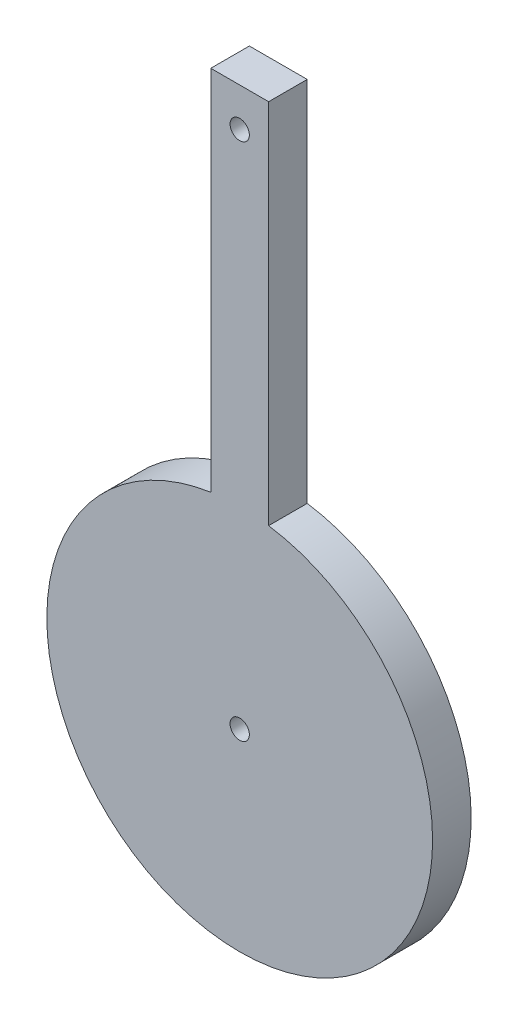
ISO-10303-21;
HEADER;
FILE_DESCRIPTION(('STEP AP214'),'2;1');
FILE_NAME('part.step','',(''),(''),'','','');
FILE_SCHEMA(('AUTOMOTIVE_DESIGN { 1 0 10303 214 1 1 1 1 }'));
ENDSEC;
DATA;
#1=APPLICATION_CONTEXT('core data for automotive mechanical design processes');
#2=APPLICATION_PROTOCOL_DEFINITION('international standard','automotive_design',2000,#1);
#3=PRODUCT_CONTEXT('',#1,'mechanical');
#4=PRODUCT('Part','Part','',(#3));
#5=PRODUCT_RELATED_PRODUCT_CATEGORY('part','',(#4));
#6=PRODUCT_DEFINITION_FORMATION('','',#4);
#7=PRODUCT_DEFINITION_CONTEXT('part definition',#1,'design');
#8=PRODUCT_DEFINITION('design','',#6,#7);
#9=PRODUCT_DEFINITION_SHAPE('','',#8);
#10=(LENGTH_UNIT() NAMED_UNIT(*) SI_UNIT(.MILLI.,.METRE.));
#11=(NAMED_UNIT(*) PLANE_ANGLE_UNIT() SI_UNIT($,.RADIAN.));
#12=(NAMED_UNIT(*) SI_UNIT($,.STERADIAN.) SOLID_ANGLE_UNIT());
#13=UNCERTAINTY_MEASURE_WITH_UNIT(LENGTH_MEASURE(1.E-05),#10,'distance_accuracy_value','');
#14=(GEOMETRIC_REPRESENTATION_CONTEXT(3) GLOBAL_UNCERTAINTY_ASSIGNED_CONTEXT((#13)) GLOBAL_UNIT_ASSIGNED_CONTEXT((#10,
#11,#12)) REPRESENTATION_CONTEXT('',''));
#15=CARTESIAN_POINT('',(0.,0.,0.));
#16=DIRECTION('',(0.,0.,1.));
#17=DIRECTION('',(1.,0.,0.));
#18=AXIS2_PLACEMENT_3D('',#15,#16,#17);
#19=CARTESIAN_POINT('',(0.,0.,-10.));
#20=DIRECTION('',(0.,0.,1.));
#21=DIRECTION('',(1.,0.,0.));
#22=AXIS2_PLACEMENT_3D('',#19,#20,#21);
#23=CYLINDRICAL_SURFACE('',#22,50.);
#24=CARTESIAN_POINT('',(0.,0.,0.));
#25=DIRECTION('',(0.,0.,1.));
#26=DIRECTION('',(1.,0.,0.));
#27=AXIS2_PLACEMENT_3D('',#24,#25,#26);
#28=CIRCLE('',#27,50.);
#29=CARTESIAN_POINT('',(-7.49999999999999,49.434299833213,0.));
#30=VERTEX_POINT('',#29);
#31=CARTESIAN_POINT('',(7.5,49.434299833213,0.));
#32=VERTEX_POINT('',#31);
#33=EDGE_CURVE('E104',#30,#32,#28,.T.);
#34=ORIENTED_EDGE('',*,*,#33,.F.);
#35=DIRECTION('',(0.,0.,1.));
#36=VECTOR('',#35,1.);
#37=CARTESIAN_POINT('',(-7.49999999999999,49.434299833213,-10.));
#38=LINE('',#37,#36);
#39=CARTESIAN_POINT('',(-7.49999999999999,49.434299833213,-10.));
#40=VERTEX_POINT('',#39);
#41=EDGE_CURVE('E11',#40,#30,#38,.T.);
#42=ORIENTED_EDGE('',*,*,#41,.F.);
#43=CARTESIAN_POINT('',(0.,0.,-10.));
#44=DIRECTION('',(0.,0.,1.));
#45=DIRECTION('',(1.,0.,0.));
#46=AXIS2_PLACEMENT_3D('',#43,#44,#45);
#47=CIRCLE('',#46,50.);
#48=CARTESIAN_POINT('',(7.5,49.434299833213,-10.));
#49=VERTEX_POINT('',#48);
#50=EDGE_CURVE('E97',#40,#49,#47,.T.);
#51=ORIENTED_EDGE('',*,*,#50,.T.);
#52=DIRECTION('',(0.,0.,1.));
#53=VECTOR('',#52,1.);
#54=CARTESIAN_POINT('',(7.5,49.434299833213,-10.));
#55=LINE('',#54,#53);
#56=EDGE_CURVE('E42',#49,#32,#55,.T.);
#57=ORIENTED_EDGE('',*,*,#56,.T.);
#58=EDGE_LOOP('',(#34,#42,#51,#57));
#59=FACE_BOUND('',#58,.T.);
#60=ADVANCED_FACE('F39',(#59),#23,.T.);
#61=CARTESIAN_POINT('',(-7.5,144.62,-10.));
#62=DIRECTION('',(-1.,0.,0.));
#63=DIRECTION('',(0.,-1.,0.));
#64=AXIS2_PLACEMENT_3D('',#61,#62,#63);
#65=PLANE('',#64);
#66=DIRECTION('',(0.,-1.,0.));
#67=VECTOR('',#66,1.);
#68=CARTESIAN_POINT('',(-7.5,144.62,0.));
#69=LINE('',#68,#67);
#70=CARTESIAN_POINT('',(-7.5,144.62,0.));
#71=VERTEX_POINT('',#70);
#72=EDGE_CURVE('E99',#71,#30,#69,.T.);
#73=ORIENTED_EDGE('',*,*,#72,.F.);
#74=DIRECTION('',(0.,0.,1.));
#75=VECTOR('',#74,1.);
#76=CARTESIAN_POINT('',(-7.5,144.62,-10.));
#77=LINE('',#76,#75);
#78=CARTESIAN_POINT('',(-7.5,144.62,-10.));
#79=VERTEX_POINT('',#78);
#80=EDGE_CURVE('E48',#79,#71,#77,.T.);
#81=ORIENTED_EDGE('',*,*,#80,.F.);
#82=DIRECTION('',(0.,-1.,0.));
#83=VECTOR('',#82,1.);
#84=CARTESIAN_POINT('',(-7.5,144.62,-10.));
#85=LINE('',#84,#83);
#86=EDGE_CURVE('E94',#79,#40,#85,.T.);
#87=ORIENTED_EDGE('',*,*,#86,.T.);
#88=ORIENTED_EDGE('',*,*,#41,.T.);
#89=EDGE_LOOP('',(#73,#81,#87,#88));
#90=FACE_BOUND('',#89,.T.);
#91=ADVANCED_FACE('F115',(#90),#65,.T.);
#92=CARTESIAN_POINT('',(7.5,144.62,-10.));
#93=DIRECTION('',(0.,1.,0.));
#94=DIRECTION('',(0.,0.,1.));
#95=AXIS2_PLACEMENT_3D('',#92,#93,#94);
#96=PLANE('',#95);
#97=DIRECTION('',(-1.,0.,0.));
#98=VECTOR('',#97,1.);
#99=CARTESIAN_POINT('',(7.5,144.62,0.));
#100=LINE('',#99,#98);
#101=CARTESIAN_POINT('',(7.5,144.62,0.));
#102=VERTEX_POINT('',#101);
#103=EDGE_CURVE('E89',#102,#71,#100,.T.);
#104=ORIENTED_EDGE('',*,*,#103,.F.);
#105=DIRECTION('',(0.,0.,1.));
#106=VECTOR('',#105,1.);
#107=CARTESIAN_POINT('',(7.5,144.62,-10.));
#108=LINE('',#107,#106);
#109=CARTESIAN_POINT('',(7.5,144.62,-10.));
#110=VERTEX_POINT('',#109);
#111=EDGE_CURVE('E84',#110,#102,#108,.T.);
#112=ORIENTED_EDGE('',*,*,#111,.F.);
#113=DIRECTION('',(-1.,0.,0.));
#114=VECTOR('',#113,1.);
#115=CARTESIAN_POINT('',(7.5,144.62,-10.));
#116=LINE('',#115,#114);
#117=EDGE_CURVE('E87',#110,#79,#116,.T.);
#118=ORIENTED_EDGE('',*,*,#117,.T.);
#119=ORIENTED_EDGE('',*,*,#80,.T.);
#120=EDGE_LOOP('',(#104,#112,#118,#119));
#121=FACE_BOUND('',#120,.T.);
#122=ADVANCED_FACE('F86',(#121),#96,.T.);
#123=CARTESIAN_POINT('',(7.5,49.434299833213,-10.));
#124=DIRECTION('',(1.,0.,0.));
#125=DIRECTION('',(0.,1.,0.));
#126=AXIS2_PLACEMENT_3D('',#123,#124,#125);
#127=PLANE('',#126);
#128=DIRECTION('',(0.,1.,0.));
#129=VECTOR('',#128,1.);
#130=CARTESIAN_POINT('',(7.5,49.434299833213,0.));
#131=LINE('',#130,#129);
#132=EDGE_CURVE('E107',#32,#102,#131,.T.);
#133=ORIENTED_EDGE('',*,*,#132,.F.);
#134=ORIENTED_EDGE('',*,*,#56,.F.);
#135=DIRECTION('',(0.,1.,0.));
#136=VECTOR('',#135,1.);
#137=CARTESIAN_POINT('',(7.5,49.434299833213,-10.));
#138=LINE('',#137,#136);
#139=EDGE_CURVE('E93',#49,#110,#138,.T.);
#140=ORIENTED_EDGE('',*,*,#139,.T.);
#141=ORIENTED_EDGE('',*,*,#111,.T.);
#142=EDGE_LOOP('',(#133,#134,#140,#141));
#143=FACE_BOUND('',#142,.T.);
#144=ADVANCED_FACE('F96',(#143),#127,.T.);
#145=CARTESIAN_POINT('',(0.,0.,-10.));
#146=DIRECTION('',(0.,0.,1.));
#147=DIRECTION('',(1.,0.,0.));
#148=AXIS2_PLACEMENT_3D('',#145,#146,#147);
#149=PLANE('',#148);
#150=CARTESIAN_POINT('',(0.,0.,-10.));
#151=DIRECTION('',(0.,0.,1.));
#152=DIRECTION('',(1.,0.,0.));
#153=AXIS2_PLACEMENT_3D('',#150,#151,#152);
#154=CIRCLE('',#153,2.5);
#155=CARTESIAN_POINT('',(2.5,0.,-10.));
#156=VERTEX_POINT('',#155);
#157=EDGE_CURVE('E151',#156,#156,#154,.F.);
#158=ORIENTED_EDGE('',*,*,#157,.F.);
#159=EDGE_LOOP('',(#158));
#160=FACE_BOUND('',#159,.T.);
#161=CARTESIAN_POINT('',(0.,134.62,-10.));
#162=DIRECTION('',(0.,0.,1.));
#163=DIRECTION('',(1.,0.,0.));
#164=AXIS2_PLACEMENT_3D('',#161,#162,#163);
#165=CIRCLE('',#164,2.5);
#166=CARTESIAN_POINT('',(2.5,134.62,-10.));
#167=VERTEX_POINT('',#166);
#168=EDGE_CURVE('E108',#167,#167,#165,.F.);
#169=ORIENTED_EDGE('',*,*,#168,.F.);
#170=EDGE_LOOP('',(#169));
#171=FACE_BOUND('',#170,.T.);
#172=ORIENTED_EDGE('',*,*,#50,.F.);
#173=ORIENTED_EDGE('',*,*,#86,.F.);
#174=ORIENTED_EDGE('',*,*,#117,.F.);
#175=ORIENTED_EDGE('',*,*,#139,.F.);
#176=EDGE_LOOP('',(#172,#173,#174,#175));
#177=FACE_BOUND('',#176,.T.);
#178=ADVANCED_FACE('F92',(#160,#171,#177),#149,.F.);
#179=CARTESIAN_POINT('',(0.,0.,0.));
#180=DIRECTION('',(0.,0.,1.));
#181=DIRECTION('',(1.,0.,0.));
#182=AXIS2_PLACEMENT_3D('',#179,#180,#181);
#183=PLANE('',#182);
#184=CARTESIAN_POINT('',(0.,0.,0.));
#185=DIRECTION('',(0.,0.,1.));
#186=DIRECTION('',(1.,0.,0.));
#187=AXIS2_PLACEMENT_3D('',#184,#185,#186);
#188=CIRCLE('',#187,2.5);
#189=CARTESIAN_POINT('',(2.5,0.,0.));
#190=VERTEX_POINT('',#189);
#191=EDGE_CURVE('E149',#190,#190,#188,.T.);
#192=ORIENTED_EDGE('',*,*,#191,.F.);
#193=EDGE_LOOP('',(#192));
#194=FACE_BOUND('',#193,.T.);
#195=CARTESIAN_POINT('',(0.,134.62,0.));
#196=DIRECTION('',(0.,0.,1.));
#197=DIRECTION('',(1.,0.,0.));
#198=AXIS2_PLACEMENT_3D('',#195,#196,#197);
#199=CIRCLE('',#198,2.5);
#200=CARTESIAN_POINT('',(2.5,134.62,0.));
#201=VERTEX_POINT('',#200);
#202=EDGE_CURVE('E152',#201,#201,#199,.T.);
#203=ORIENTED_EDGE('',*,*,#202,.F.);
#204=EDGE_LOOP('',(#203));
#205=FACE_BOUND('',#204,.T.);
#206=ORIENTED_EDGE('',*,*,#33,.T.);
#207=ORIENTED_EDGE('',*,*,#132,.T.);
#208=ORIENTED_EDGE('',*,*,#103,.T.);
#209=ORIENTED_EDGE('',*,*,#72,.T.);
#210=EDGE_LOOP('',(#206,#207,#208,#209));
#211=FACE_BOUND('',#210,.T.);
#212=ADVANCED_FACE('F114',(#194,#205,#211),#183,.T.);
#213=CARTESIAN_POINT('',(0.,134.62,-10.001));
#214=DIRECTION('',(0.,0.,1.));
#215=DIRECTION('',(1.,0.,0.));
#216=AXIS2_PLACEMENT_3D('',#213,#214,#215);
#217=CYLINDRICAL_SURFACE('',#216,2.5);
#218=ORIENTED_EDGE('',*,*,#202,.T.);
#219=EDGE_LOOP('',(#218));
#220=FACE_BOUND('',#219,.T.);
#221=ORIENTED_EDGE('',*,*,#168,.T.);
#222=EDGE_LOOP('',(#221));
#223=FACE_BOUND('',#222,.T.);
#224=ADVANCED_FACE('F133',(#220,#223),#217,.F.);
#225=CARTESIAN_POINT('',(0.,0.,-10.001));
#226=DIRECTION('',(0.,0.,1.));
#227=DIRECTION('',(1.,0.,0.));
#228=AXIS2_PLACEMENT_3D('',#225,#226,#227);
#229=CYLINDRICAL_SURFACE('',#228,2.5);
#230=ORIENTED_EDGE('',*,*,#191,.T.);
#231=EDGE_LOOP('',(#230));
#232=FACE_BOUND('',#231,.T.);
#233=ORIENTED_EDGE('',*,*,#157,.T.);
#234=EDGE_LOOP('',(#233));
#235=FACE_BOUND('',#234,.T.);
#236=ADVANCED_FACE('F140',(#232,#235),#229,.F.);
#237=CLOSED_SHELL('',(#60,#91,#122,#144,#178,#212,#224,#236));
#238=MANIFOLD_SOLID_BREP('B2',#237);
#239=ADVANCED_BREP_SHAPE_REPRESENTATION('',(#18,#238),#14);
#240=SHAPE_DEFINITION_REPRESENTATION(#9,#239);
ENDSEC;
END-ISO-10303-21;
